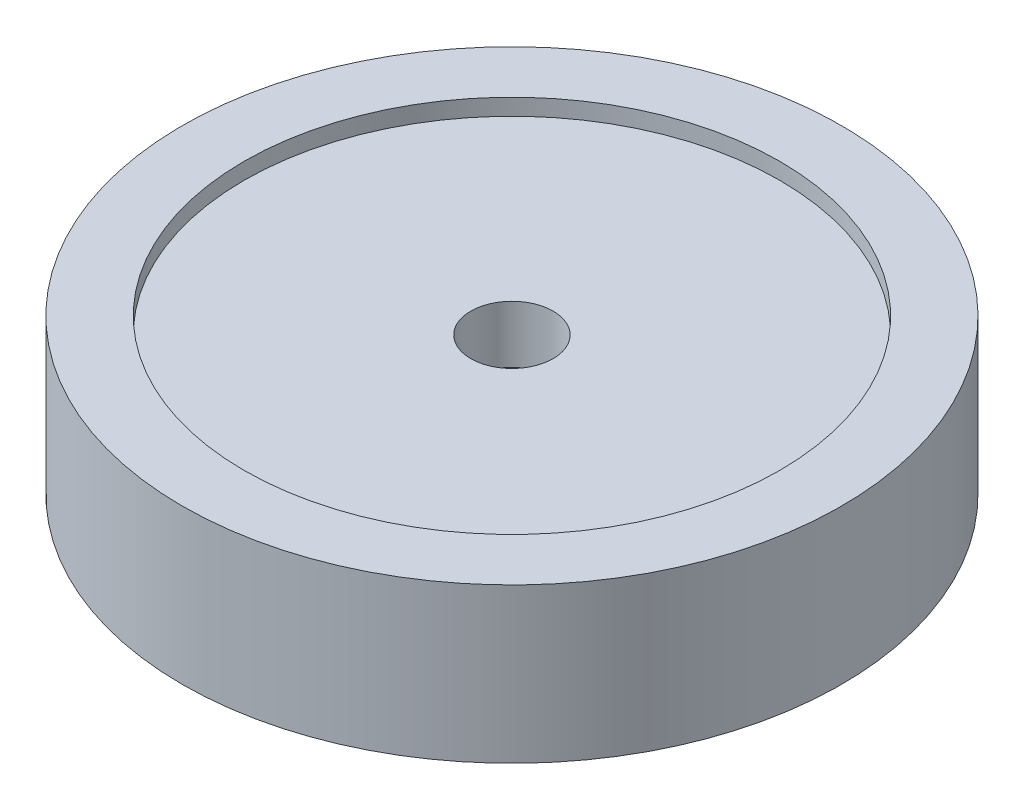
ISO-10303-21;
HEADER;
FILE_DESCRIPTION(('STEP AP214'),'2;1');
FILE_NAME('part.step','',(''),(''),'','','');
FILE_SCHEMA(('AUTOMOTIVE_DESIGN { 1 0 10303 214 1 1 1 1 }'));
ENDSEC;
DATA;
#1=APPLICATION_CONTEXT('core data for automotive mechanical design processes');
#2=APPLICATION_PROTOCOL_DEFINITION('international standard','automotive_design',2000,#1);
#3=PRODUCT_CONTEXT('',#1,'mechanical');
#4=PRODUCT('Part','Part','',(#3));
#5=PRODUCT_RELATED_PRODUCT_CATEGORY('part','',(#4));
#6=PRODUCT_DEFINITION_FORMATION('','',#4);
#7=PRODUCT_DEFINITION_CONTEXT('part definition',#1,'design');
#8=PRODUCT_DEFINITION('design','',#6,#7);
#9=PRODUCT_DEFINITION_SHAPE('','',#8);
#10=(LENGTH_UNIT() NAMED_UNIT(*) SI_UNIT(.MILLI.,.METRE.));
#11=(NAMED_UNIT(*) PLANE_ANGLE_UNIT() SI_UNIT($,.RADIAN.));
#12=(NAMED_UNIT(*) SI_UNIT($,.STERADIAN.) SOLID_ANGLE_UNIT());
#13=UNCERTAINTY_MEASURE_WITH_UNIT(LENGTH_MEASURE(1.E-05),#10,'distance_accuracy_value','');
#14=(GEOMETRIC_REPRESENTATION_CONTEXT(3) GLOBAL_UNCERTAINTY_ASSIGNED_CONTEXT((#13)) GLOBAL_UNIT_ASSIGNED_CONTEXT((#10,
#11,#12)) REPRESENTATION_CONTEXT('',''));
#15=CARTESIAN_POINT('',(0.,0.,0.));
#16=DIRECTION('',(0.,0.,1.));
#17=DIRECTION('',(1.,0.,0.));
#18=AXIS2_PLACEMENT_3D('',#15,#16,#17);
#19=CARTESIAN_POINT('',(0.,-1.2E-05,0.));
#20=DIRECTION('',(0.,1.,0.));
#21=DIRECTION('',(0.,0.,1.));
#22=AXIS2_PLACEMENT_3D('',#19,#20,#21);
#23=CYLINDRICAL_SURFACE('',#22,5.);
#24=CARTESIAN_POINT('',(0.,9.8,0.));
#25=DIRECTION('',(0.,-1.,0.));
#26=DIRECTION('',(0.,0.,-1.));
#27=AXIS2_PLACEMENT_3D('',#24,#25,#26);
#28=CIRCLE('',#27,5.);
#29=CARTESIAN_POINT('',(0.,9.8,5.));
#30=VERTEX_POINT('',#29);
#31=EDGE_CURVE('E111',#30,#30,#28,.T.);
#32=CARTESIAN_POINT('',(0.,16.75,0.));
#33=DIRECTION('',(0.,1.,0.));
#34=DIRECTION('',(0.,0.,1.));
#35=AXIS2_PLACEMENT_3D('',#32,#33,#34);
#36=CIRCLE('',#35,5.);
#37=CARTESIAN_POINT('',(0.,16.75,5.));
#38=VERTEX_POINT('',#37);
#39=EDGE_CURVE('E41',#38,#38,#36,.F.);
#40=CARTESIAN_POINT('',(0.,9.8,5.));
#41=CARTESIAN_POINT('',(0.,9.87239583333334,5.));
#42=CARTESIAN_POINT('',(0.,9.94479166666667,5.));
#43=CARTESIAN_POINT('',(0.,10.0895833333333,5.));
#44=CARTESIAN_POINT('',(0.,10.1619791666667,5.));
#45=CARTESIAN_POINT('',(0.,10.3067708333333,5.));
#46=CARTESIAN_POINT('',(0.,10.3791666666667,5.));
#47=CARTESIAN_POINT('',(0.,10.5239583333333,5.));
#48=CARTESIAN_POINT('',(0.,10.5963541666667,5.));
#49=CARTESIAN_POINT('',(0.,10.7411458333333,5.));
#50=CARTESIAN_POINT('',(0.,10.8135416666667,5.));
#51=CARTESIAN_POINT('',(0.,10.9583333333333,5.));
#52=CARTESIAN_POINT('',(0.,11.0307291666667,5.));
#53=CARTESIAN_POINT('',(0.,11.1755208333333,5.));
#54=CARTESIAN_POINT('',(0.,11.2479166666667,5.));
#55=CARTESIAN_POINT('',(0.,11.3927083333333,5.));
#56=CARTESIAN_POINT('',(0.,11.4651041666667,5.));
#57=CARTESIAN_POINT('',(0.,11.6098958333333,5.));
#58=CARTESIAN_POINT('',(0.,11.6822916666667,5.));
#59=CARTESIAN_POINT('',(0.,11.8270833333333,5.));
#60=CARTESIAN_POINT('',(0.,11.8994791666667,5.));
#61=CARTESIAN_POINT('',(0.,12.0442708333333,5.));
#62=CARTESIAN_POINT('',(0.,12.1166666666667,5.));
#63=CARTESIAN_POINT('',(0.,12.2614583333333,5.));
#64=CARTESIAN_POINT('',(0.,12.3338541666667,5.));
#65=CARTESIAN_POINT('',(0.,12.4786458333333,5.));
#66=CARTESIAN_POINT('',(0.,12.5510416666667,5.));
#67=CARTESIAN_POINT('',(0.,12.6958333333333,5.));
#68=CARTESIAN_POINT('',(0.,12.7682291666667,5.));
#69=CARTESIAN_POINT('',(0.,12.9130208333333,5.));
#70=CARTESIAN_POINT('',(0.,12.9854166666667,5.));
#71=CARTESIAN_POINT('',(0.,13.1302083333333,5.));
#72=CARTESIAN_POINT('',(0.,13.2026041666667,5.));
#73=CARTESIAN_POINT('',(0.,13.3473958333333,5.));
#74=CARTESIAN_POINT('',(0.,13.4197916666667,5.));
#75=CARTESIAN_POINT('',(0.,13.5645833333333,5.));
#76=CARTESIAN_POINT('',(0.,13.6369791666667,5.));
#77=CARTESIAN_POINT('',(0.,13.7817708333333,5.));
#78=CARTESIAN_POINT('',(0.,13.8541666666667,5.));
#79=CARTESIAN_POINT('',(0.,13.9989583333333,5.));
#80=CARTESIAN_POINT('',(0.,14.0713541666667,5.));
#81=CARTESIAN_POINT('',(0.,14.2161458333333,5.));
#82=CARTESIAN_POINT('',(0.,14.2885416666667,5.));
#83=CARTESIAN_POINT('',(0.,14.4333333333333,5.));
#84=CARTESIAN_POINT('',(0.,14.5057291666667,5.));
#85=CARTESIAN_POINT('',(0.,14.6505208333333,5.));
#86=CARTESIAN_POINT('',(0.,14.7229166666667,5.));
#87=CARTESIAN_POINT('',(0.,14.8677083333333,5.));
#88=CARTESIAN_POINT('',(0.,14.9401041666667,5.));
#89=CARTESIAN_POINT('',(0.,15.0848958333333,5.));
#90=CARTESIAN_POINT('',(0.,15.1572916666667,5.));
#91=CARTESIAN_POINT('',(0.,15.3020833333333,5.));
#92=CARTESIAN_POINT('',(0.,15.3744791666667,5.));
#93=CARTESIAN_POINT('',(0.,15.5192708333333,5.));
#94=CARTESIAN_POINT('',(0.,15.5916666666667,5.));
#95=CARTESIAN_POINT('',(0.,15.7364583333333,5.));
#96=CARTESIAN_POINT('',(0.,15.8088541666667,5.));
#97=CARTESIAN_POINT('',(0.,15.9536458333333,5.));
#98=CARTESIAN_POINT('',(0.,16.0260416666667,5.));
#99=CARTESIAN_POINT('',(0.,16.1708333333333,5.));
#100=CARTESIAN_POINT('',(0.,16.2432291666667,5.));
#101=CARTESIAN_POINT('',(0.,16.3880208333333,5.));
#102=CARTESIAN_POINT('',(0.,16.4604166666667,5.));
#103=CARTESIAN_POINT('',(0.,16.6052083333333,5.));
#104=CARTESIAN_POINT('',(0.,16.6776041666667,5.));
#105=CARTESIAN_POINT('',(0.,16.75,5.));
#106=B_SPLINE_CURVE_WITH_KNOTS('',3,(#40,#41,#42,#43,#44,#45,#46,#47,#48,#49,#50,#51,#52,#53,
#54,#55,#56,#57,#58,#59,#60,#61,#62,#63,#64,#65,#66,#67,#68,#69,#70,#71,#72,#73,#74,#75,#76,#77,
#78,#79,#80,#81,#82,#83,#84,#85,#86,#87,#88,#89,#90,#91,#92,#93,#94,#95,#96,#97,#98,#99,#100,
#101,#102,#103,#104,#105),.UNSPECIFIED.,.F.,.F.,(4,2,2,2,2,2,2,2,2,2,2,2,2,2,2,2,2,2,2,2,2,2,2,
2,2,2,2,2,2,2,2,2,4),(0.,0.2171875,0.434375000000001,0.651562499999999,0.86875,1.0859375,
1.303125,1.5203125,1.7375,1.9546875,2.171875,2.3890625,2.60625,2.8234375,3.040625,3.2578125,
3.475,3.6921875,3.909375,4.1265625,4.34375,4.5609375,4.778125,4.9953125,5.2125,5.4296875,
5.646875,5.86406249999999,6.08124999999999,6.2984375,6.515625,6.7328125,6.95),.UNSPECIFIED.);
#107=EDGE_CURVE('BSEAM37',#30,#38,#106,.T.);
#108=ORIENTED_EDGE('',*,*,#31,.T.);
#109=ORIENTED_EDGE('',*,*,#39,.F.);
#110=ORIENTED_EDGE('',*,*,#107,.T.);
#111=ORIENTED_EDGE('',*,*,#107,.F.);
#112=EDGE_LOOP('',(#108,#110,#109,#111));
#113=FACE_BOUND('',#112,.T.);
#114=ADVANCED_FACE('F37',(#113),#23,.F.);
#115=CARTESIAN_POINT('',(0.,18.75,0.));
#116=DIRECTION('',(0.,-1.,0.));
#117=DIRECTION('',(0.,0.,-1.));
#118=AXIS2_PLACEMENT_3D('',#115,#116,#117);
#119=CYLINDRICAL_SURFACE('',#118,40.);
#120=CARTESIAN_POINT('',(0.,18.75,0.));
#121=DIRECTION('',(0.,1.,0.));
#122=DIRECTION('',(0.,0.,1.));
#123=AXIS2_PLACEMENT_3D('',#120,#121,#122);
#124=CIRCLE('',#123,40.);
#125=CARTESIAN_POINT('',(0.,18.75,40.));
#126=VERTEX_POINT('',#125);
#127=EDGE_CURVE('E11',#126,#126,#124,.T.);
#128=ORIENTED_EDGE('',*,*,#127,.F.);
#129=EDGE_LOOP('',(#128));
#130=FACE_BOUND('',#129,.T.);
#131=CARTESIAN_POINT('',(0.,0.,0.));
#132=DIRECTION('',(0.,1.,0.));
#133=DIRECTION('',(0.,0.,1.));
#134=AXIS2_PLACEMENT_3D('',#131,#132,#133);
#135=CIRCLE('',#134,40.);
#136=CARTESIAN_POINT('',(0.,0.,40.));
#137=VERTEX_POINT('',#136);
#138=EDGE_CURVE('E46',#137,#137,#135,.T.);
#139=ORIENTED_EDGE('',*,*,#138,.T.);
#140=EDGE_LOOP('',(#139));
#141=FACE_BOUND('',#140,.T.);
#142=ADVANCED_FACE('F39',(#130,#141),#119,.T.);
#143=CARTESIAN_POINT('',(0.,18.75,0.));
#144=DIRECTION('',(0.,1.,0.));
#145=DIRECTION('',(0.,0.,1.));
#146=AXIS2_PLACEMENT_3D('',#143,#144,#145);
#147=PLANE('',#146);
#148=CARTESIAN_POINT('',(0.,18.75,0.));
#149=DIRECTION('',(0.,1.,0.));
#150=DIRECTION('',(0.,0.,1.));
#151=AXIS2_PLACEMENT_3D('',#148,#149,#150);
#152=CIRCLE('',#151,32.5);
#153=CARTESIAN_POINT('',(0.,18.75,32.5));
#154=VERTEX_POINT('',#153);
#155=EDGE_CURVE('E129',#154,#154,#152,.T.);
#156=ORIENTED_EDGE('',*,*,#155,.F.);
#157=EDGE_LOOP('',(#156));
#158=FACE_BOUND('',#157,.T.);
#159=ORIENTED_EDGE('',*,*,#127,.T.);
#160=EDGE_LOOP('',(#159));
#161=FACE_BOUND('',#160,.T.);
#162=ADVANCED_FACE('F138',(#158,#161),#147,.T.);
#163=CARTESIAN_POINT('',(0.,0.,0.));
#164=DIRECTION('',(0.,1.,0.));
#165=DIRECTION('',(0.,0.,1.));
#166=AXIS2_PLACEMENT_3D('',#163,#164,#165);
#167=PLANE('',#166);
#168=DIRECTION('',(0.,0.,1.));
#169=VECTOR('',#168,1.);
#170=CARTESIAN_POINT('',(11.5,0.,-11.5));
#171=LINE('',#170,#169);
#172=CARTESIAN_POINT('',(11.5,0.,-11.5));
#173=VERTEX_POINT('',#172);
#174=CARTESIAN_POINT('',(11.5,0.,31.5));
#175=VERTEX_POINT('',#174);
#176=EDGE_CURVE('E99',#173,#175,#171,.T.);
#177=ORIENTED_EDGE('',*,*,#176,.F.);
#178=DIRECTION('',(1.,0.,0.));
#179=VECTOR('',#178,1.);
#180=CARTESIAN_POINT('',(-11.5,0.,-11.5));
#181=LINE('',#180,#179);
#182=CARTESIAN_POINT('',(-11.5,0.,-11.5));
#183=VERTEX_POINT('',#182);
#184=EDGE_CURVE('E54',#183,#173,#181,.T.);
#185=ORIENTED_EDGE('',*,*,#184,.F.);
#186=DIRECTION('',(0.,0.,1.));
#187=VECTOR('',#186,1.);
#188=CARTESIAN_POINT('',(-11.5,0.,-11.5));
#189=LINE('',#188,#187);
#190=CARTESIAN_POINT('',(-11.5,0.,31.5));
#191=VERTEX_POINT('',#190);
#192=EDGE_CURVE('E105',#183,#191,#189,.T.);
#193=ORIENTED_EDGE('',*,*,#192,.T.);
#194=DIRECTION('',(1.,0.,0.));
#195=VECTOR('',#194,1.);
#196=CARTESIAN_POINT('',(-11.5,0.,31.5));
#197=LINE('',#196,#195);
#198=EDGE_CURVE('E113',#191,#175,#197,.T.);
#199=ORIENTED_EDGE('',*,*,#198,.T.);
#200=EDGE_LOOP('',(#177,#185,#193,#199));
#201=FACE_BOUND('',#200,.T.);
#202=ORIENTED_EDGE('',*,*,#138,.F.);
#203=EDGE_LOOP('',(#202));
#204=FACE_BOUND('',#203,.T.);
#205=ADVANCED_FACE('F141',(#201,#204),#167,.F.);
#206=CARTESIAN_POINT('',(-11.5,9.8,-11.5));
#207=DIRECTION('',(0.,0.,-1.));
#208=DIRECTION('',(-1.,0.,0.));
#209=AXIS2_PLACEMENT_3D('',#206,#207,#208);
#210=PLANE('',#209);
#211=ORIENTED_EDGE('',*,*,#184,.T.);
#212=DIRECTION('',(0.,-1.,0.));
#213=VECTOR('',#212,1.);
#214=CARTESIAN_POINT('',(11.5,9.8,-11.5));
#215=LINE('',#214,#213);
#216=CARTESIAN_POINT('',(11.5,9.8,-11.5));
#217=VERTEX_POINT('',#216);
#218=EDGE_CURVE('E77',#217,#173,#215,.T.);
#219=ORIENTED_EDGE('',*,*,#218,.F.);
#220=DIRECTION('',(1.,0.,0.));
#221=VECTOR('',#220,1.);
#222=CARTESIAN_POINT('',(-11.5,9.8,-11.5));
#223=LINE('',#222,#221);
#224=CARTESIAN_POINT('',(-11.5,9.8,-11.5));
#225=VERTEX_POINT('',#224);
#226=EDGE_CURVE('E103',#225,#217,#223,.T.);
#227=ORIENTED_EDGE('',*,*,#226,.F.);
#228=DIRECTION('',(0.,-1.,0.));
#229=VECTOR('',#228,1.);
#230=CARTESIAN_POINT('',(-11.5,9.8,-11.5));
#231=LINE('',#230,#229);
#232=EDGE_CURVE('E62',#225,#183,#231,.T.);
#233=ORIENTED_EDGE('',*,*,#232,.T.);
#234=EDGE_LOOP('',(#211,#219,#227,#233));
#235=FACE_BOUND('',#234,.T.);
#236=ADVANCED_FACE('F150',(#235),#210,.F.);
#237=CARTESIAN_POINT('',(-11.5,9.8,-11.5));
#238=DIRECTION('',(1.,0.,0.));
#239=DIRECTION('',(0.,0.,-1.));
#240=AXIS2_PLACEMENT_3D('',#237,#238,#239);
#241=PLANE('',#240);
#242=ORIENTED_EDGE('',*,*,#192,.F.);
#243=ORIENTED_EDGE('',*,*,#232,.F.);
#244=DIRECTION('',(0.,0.,1.));
#245=VECTOR('',#244,1.);
#246=CARTESIAN_POINT('',(-11.5,9.8,-11.5));
#247=LINE('',#246,#245);
#248=CARTESIAN_POINT('',(-11.5,9.8,31.5));
#249=VERTEX_POINT('',#248);
#250=EDGE_CURVE('E92',#225,#249,#247,.T.);
#251=ORIENTED_EDGE('',*,*,#250,.T.);
#252=DIRECTION('',(0.,-1.,0.));
#253=VECTOR('',#252,1.);
#254=CARTESIAN_POINT('',(-11.5,9.8,31.5));
#255=LINE('',#254,#253);
#256=EDGE_CURVE('E89',#249,#191,#255,.T.);
#257=ORIENTED_EDGE('',*,*,#256,.T.);
#258=EDGE_LOOP('',(#242,#243,#251,#257));
#259=FACE_BOUND('',#258,.T.);
#260=ADVANCED_FACE('F155',(#259),#241,.T.);
#261=CARTESIAN_POINT('',(-11.5,9.8,31.5));
#262=DIRECTION('',(0.,0.,-1.));
#263=DIRECTION('',(-1.,0.,0.));
#264=AXIS2_PLACEMENT_3D('',#261,#262,#263);
#265=PLANE('',#264);
#266=ORIENTED_EDGE('',*,*,#198,.F.);
#267=ORIENTED_EDGE('',*,*,#256,.F.);
#268=DIRECTION('',(1.,0.,0.));
#269=VECTOR('',#268,1.);
#270=CARTESIAN_POINT('',(-11.5,9.8,31.5));
#271=LINE('',#270,#269);
#272=CARTESIAN_POINT('',(11.5,9.8,31.5));
#273=VERTEX_POINT('',#272);
#274=EDGE_CURVE('E83',#249,#273,#271,.T.);
#275=ORIENTED_EDGE('',*,*,#274,.T.);
#276=DIRECTION('',(0.,-1.,0.));
#277=VECTOR('',#276,1.);
#278=CARTESIAN_POINT('',(11.5,9.8,31.5));
#279=LINE('',#278,#277);
#280=EDGE_CURVE('E87',#273,#175,#279,.T.);
#281=ORIENTED_EDGE('',*,*,#280,.T.);
#282=EDGE_LOOP('',(#266,#267,#275,#281));
#283=FACE_BOUND('',#282,.T.);
#284=ADVANCED_FACE('F86',(#283),#265,.T.);
#285=CARTESIAN_POINT('',(11.5,9.8,-11.5));
#286=DIRECTION('',(1.,0.,0.));
#287=DIRECTION('',(0.,0.,-1.));
#288=AXIS2_PLACEMENT_3D('',#285,#286,#287);
#289=PLANE('',#288);
#290=ORIENTED_EDGE('',*,*,#176,.T.);
#291=ORIENTED_EDGE('',*,*,#280,.F.);
#292=DIRECTION('',(0.,0.,1.));
#293=VECTOR('',#292,1.);
#294=CARTESIAN_POINT('',(11.5,9.8,-11.5));
#295=LINE('',#294,#293);
#296=EDGE_CURVE('E93',#217,#273,#295,.T.);
#297=ORIENTED_EDGE('',*,*,#296,.F.);
#298=ORIENTED_EDGE('',*,*,#218,.T.);
#299=EDGE_LOOP('',(#290,#291,#297,#298));
#300=FACE_BOUND('',#299,.T.);
#301=ADVANCED_FACE('F96',(#300),#289,.F.);
#302=CARTESIAN_POINT('',(0.,9.8,0.));
#303=DIRECTION('',(0.,-1.,0.));
#304=DIRECTION('',(0.,0.,-1.));
#305=AXIS2_PLACEMENT_3D('',#302,#303,#304);
#306=PLANE('',#305);
#307=ORIENTED_EDGE('',*,*,#31,.F.);
#308=EDGE_LOOP('',(#307));
#309=FACE_BOUND('',#308,.T.);
#310=ORIENTED_EDGE('',*,*,#226,.T.);
#311=ORIENTED_EDGE('',*,*,#296,.T.);
#312=ORIENTED_EDGE('',*,*,#274,.F.);
#313=ORIENTED_EDGE('',*,*,#250,.F.);
#314=EDGE_LOOP('',(#310,#311,#312,#313));
#315=FACE_BOUND('',#314,.T.);
#316=ADVANCED_FACE('F102',(#309,#315),#306,.T.);
#317=CARTESIAN_POINT('',(0.,16.75,0.));
#318=DIRECTION('',(0.,1.,0.));
#319=DIRECTION('',(0.,0.,1.));
#320=AXIS2_PLACEMENT_3D('',#317,#318,#319);
#321=PLANE('',#320);
#322=CARTESIAN_POINT('',(0.,16.75,0.));
#323=DIRECTION('',(0.,1.,0.));
#324=DIRECTION('',(0.,0.,1.));
#325=AXIS2_PLACEMENT_3D('',#322,#323,#324);
#326=CIRCLE('',#325,32.5);
#327=CARTESIAN_POINT('',(0.,16.75,32.5));
#328=VERTEX_POINT('',#327);
#329=EDGE_CURVE('E125',#328,#328,#326,.T.);
#330=ORIENTED_EDGE('',*,*,#329,.T.);
#331=EDGE_LOOP('',(#330));
#332=FACE_BOUND('',#331,.T.);
#333=ORIENTED_EDGE('',*,*,#39,.T.);
#334=EDGE_LOOP('',(#333));
#335=FACE_BOUND('',#334,.T.);
#336=ADVANCED_FACE('F167',(#332,#335),#321,.T.);
#337=CARTESIAN_POINT('',(0.,16.75,0.));
#338=DIRECTION('',(0.,1.,0.));
#339=DIRECTION('',(0.,0.,1.));
#340=AXIS2_PLACEMENT_3D('',#337,#338,#339);
#341=CYLINDRICAL_SURFACE('',#340,32.5);
#342=ORIENTED_EDGE('',*,*,#329,.F.);
#343=EDGE_LOOP('',(#342));
#344=FACE_BOUND('',#343,.T.);
#345=ORIENTED_EDGE('',*,*,#155,.T.);
#346=EDGE_LOOP('',(#345));
#347=FACE_BOUND('',#346,.T.);
#348=ADVANCED_FACE('F136',(#344,#347),#341,.F.);
#349=CLOSED_SHELL('',(#114,#142,#162,#205,#236,#260,#284,#301,#316,#336,#348));
#350=MANIFOLD_SOLID_BREP('B2',#349);
#351=ADVANCED_BREP_SHAPE_REPRESENTATION('',(#18,#350),#14);
#352=SHAPE_DEFINITION_REPRESENTATION(#9,#351);
ENDSEC;
END-ISO-10303-21;
